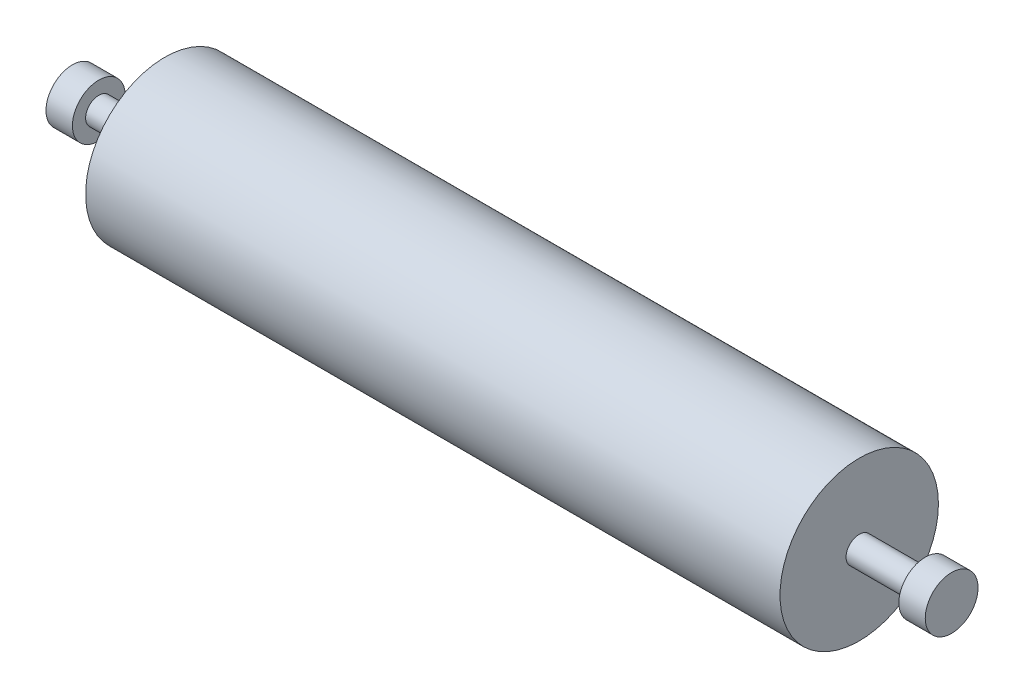
ISO-10303-21;
HEADER;
FILE_DESCRIPTION(('STEP AP214'),'2;1');
FILE_NAME('part.step','',(''),(''),'','','');
FILE_SCHEMA(('AUTOMOTIVE_DESIGN { 1 0 10303 214 1 1 1 1 }'));
ENDSEC;
DATA;
#1=APPLICATION_CONTEXT('core data for automotive mechanical design processes');
#2=APPLICATION_PROTOCOL_DEFINITION('international standard','automotive_design',2000,#1);
#3=PRODUCT_CONTEXT('',#1,'mechanical');
#4=PRODUCT('Part','Part','',(#3));
#5=PRODUCT_RELATED_PRODUCT_CATEGORY('part','',(#4));
#6=PRODUCT_DEFINITION_FORMATION('','',#4);
#7=PRODUCT_DEFINITION_CONTEXT('part definition',#1,'design');
#8=PRODUCT_DEFINITION('design','',#6,#7);
#9=PRODUCT_DEFINITION_SHAPE('','',#8);
#10=(LENGTH_UNIT() NAMED_UNIT(*) SI_UNIT(.MILLI.,.METRE.));
#11=(NAMED_UNIT(*) PLANE_ANGLE_UNIT() SI_UNIT($,.RADIAN.));
#12=(NAMED_UNIT(*) SI_UNIT($,.STERADIAN.) SOLID_ANGLE_UNIT());
#13=UNCERTAINTY_MEASURE_WITH_UNIT(LENGTH_MEASURE(1.E-05),#10,'distance_accuracy_value','');
#14=(GEOMETRIC_REPRESENTATION_CONTEXT(3) GLOBAL_UNCERTAINTY_ASSIGNED_CONTEXT((#13)) GLOBAL_UNIT_ASSIGNED_CONTEXT((#10,
#11,#12)) REPRESENTATION_CONTEXT('',''));
#15=CARTESIAN_POINT('',(0.,0.,0.));
#16=DIRECTION('',(0.,0.,1.));
#17=DIRECTION('',(1.,0.,0.));
#18=AXIS2_PLACEMENT_3D('',#15,#16,#17);
#19=CARTESIAN_POINT('',(-167.005,0.,0.));
#20=DIRECTION('',(1.,0.,0.));
#21=DIRECTION('',(0.,0.,-1.));
#22=AXIS2_PLACEMENT_3D('',#19,#20,#21);
#23=CYLINDRICAL_SURFACE('',#22,38.1);
#24=CARTESIAN_POINT('',(-167.005,0.,0.));
#25=DIRECTION('',(1.,0.,0.));
#26=DIRECTION('',(0.,0.,-1.));
#27=AXIS2_PLACEMENT_3D('',#24,#25,#26);
#28=CIRCLE('',#27,38.1);
#29=CARTESIAN_POINT('',(-167.005,0.,-38.1));
#30=VERTEX_POINT('',#29);
#31=EDGE_CURVE('E48',#30,#30,#28,.T.);
#32=ORIENTED_EDGE('',*,*,#31,.T.);
#33=EDGE_LOOP('',(#32));
#34=FACE_BOUND('',#33,.T.);
#35=CARTESIAN_POINT('',(167.005,0.,0.));
#36=DIRECTION('',(1.,0.,0.));
#37=DIRECTION('',(0.,0.,-1.));
#38=AXIS2_PLACEMENT_3D('',#35,#36,#37);
#39=CIRCLE('',#38,38.1);
#40=CARTESIAN_POINT('',(167.005,0.,-38.1));
#41=VERTEX_POINT('',#40);
#42=EDGE_CURVE('E58',#41,#41,#39,.T.);
#43=ORIENTED_EDGE('',*,*,#42,.F.);
#44=EDGE_LOOP('',(#43));
#45=FACE_BOUND('',#44,.T.);
#46=ADVANCED_FACE('F45',(#34,#45),#23,.T.);
#47=CARTESIAN_POINT('',(-167.005,0.,0.));
#48=DIRECTION('',(1.,0.,0.));
#49=DIRECTION('',(0.,0.,-1.));
#50=AXIS2_PLACEMENT_3D('',#47,#48,#49);
#51=PLANE('',#50);
#52=CARTESIAN_POINT('',(-167.005,0.,0.));
#53=DIRECTION('',(-1.,0.,0.));
#54=DIRECTION('',(0.,0.,1.));
#55=AXIS2_PLACEMENT_3D('',#52,#53,#54);
#56=CIRCLE('',#55,6.35);
#57=CARTESIAN_POINT('',(-167.005,0.,6.35));
#58=VERTEX_POINT('',#57);
#59=EDGE_CURVE('E10',#58,#58,#56,.T.);
#60=ORIENTED_EDGE('',*,*,#59,.F.);
#61=EDGE_LOOP('',(#60));
#62=FACE_BOUND('',#61,.T.);
#63=ORIENTED_EDGE('',*,*,#31,.F.);
#64=EDGE_LOOP('',(#63));
#65=FACE_BOUND('',#64,.T.);
#66=ADVANCED_FACE('F113',(#62,#65),#51,.F.);
#67=CARTESIAN_POINT('',(167.005,0.,0.));
#68=DIRECTION('',(1.,0.,0.));
#69=DIRECTION('',(0.,0.,-1.));
#70=AXIS2_PLACEMENT_3D('',#67,#68,#69);
#71=PLANE('',#70);
#72=CARTESIAN_POINT('',(167.005,0.,0.));
#73=DIRECTION('',(-1.,0.,0.));
#74=DIRECTION('',(0.,0.,1.));
#75=AXIS2_PLACEMENT_3D('',#72,#73,#74);
#76=CIRCLE('',#75,6.35);
#77=CARTESIAN_POINT('',(167.005,0.,6.35));
#78=VERTEX_POINT('',#77);
#79=EDGE_CURVE('E79',#78,#78,#76,.T.);
#80=ORIENTED_EDGE('',*,*,#79,.T.);
#81=EDGE_LOOP('',(#80));
#82=FACE_BOUND('',#81,.T.);
#83=ORIENTED_EDGE('',*,*,#42,.T.);
#84=EDGE_LOOP('',(#83));
#85=FACE_BOUND('',#84,.T.);
#86=ADVANCED_FACE('F118',(#82,#85),#71,.T.);
#87=CARTESIAN_POINT('',(-198.755,0.,0.));
#88=DIRECTION('',(1.,0.,0.));
#89=DIRECTION('',(0.,0.,-1.));
#90=AXIS2_PLACEMENT_3D('',#87,#88,#89);
#91=CYLINDRICAL_SURFACE('',#90,6.35);
#92=CARTESIAN_POINT('',(-198.755,0.,0.));
#93=DIRECTION('',(-1.,0.,0.));
#94=DIRECTION('',(0.,0.,1.));
#95=AXIS2_PLACEMENT_3D('',#92,#93,#94);
#96=CIRCLE('',#95,6.35);
#97=CARTESIAN_POINT('',(-198.755,0.,6.35));
#98=VERTEX_POINT('',#97);
#99=EDGE_CURVE('E60',#98,#98,#96,.T.);
#100=ORIENTED_EDGE('',*,*,#99,.F.);
#101=EDGE_LOOP('',(#100));
#102=FACE_BOUND('',#101,.T.);
#103=ORIENTED_EDGE('',*,*,#59,.T.);
#104=EDGE_LOOP('',(#103));
#105=FACE_BOUND('',#104,.T.);
#106=ADVANCED_FACE('F127',(#102,#105),#91,.T.);
#107=CARTESIAN_POINT('',(-211.455,0.,0.));
#108=DIRECTION('',(1.,0.,0.));
#109=DIRECTION('',(0.,0.,-1.));
#110=AXIS2_PLACEMENT_3D('',#107,#108,#109);
#111=CYLINDRICAL_SURFACE('',#110,12.7);
#112=CARTESIAN_POINT('',(-211.455,0.,0.));
#113=DIRECTION('',(-1.,0.,0.));
#114=DIRECTION('',(0.,0.,1.));
#115=AXIS2_PLACEMENT_3D('',#112,#113,#114);
#116=CIRCLE('',#115,12.7);
#117=CARTESIAN_POINT('',(-211.455,0.,12.7));
#118=VERTEX_POINT('',#117);
#119=EDGE_CURVE('E68',#118,#118,#116,.T.);
#120=ORIENTED_EDGE('',*,*,#119,.F.);
#121=EDGE_LOOP('',(#120));
#122=FACE_BOUND('',#121,.T.);
#123=CARTESIAN_POINT('',(-198.755,0.,0.));
#124=DIRECTION('',(-1.,0.,0.));
#125=DIRECTION('',(0.,0.,1.));
#126=AXIS2_PLACEMENT_3D('',#123,#124,#125);
#127=CIRCLE('',#126,12.7);
#128=CARTESIAN_POINT('',(-198.755,0.,12.7));
#129=VERTEX_POINT('',#128);
#130=EDGE_CURVE('E73',#129,#129,#127,.T.);
#131=ORIENTED_EDGE('',*,*,#130,.T.);
#132=EDGE_LOOP('',(#131));
#133=FACE_BOUND('',#132,.T.);
#134=ADVANCED_FACE('F132',(#122,#133),#111,.T.);
#135=CARTESIAN_POINT('',(-211.455,0.,0.));
#136=DIRECTION('',(-1.,0.,0.));
#137=DIRECTION('',(0.,0.,1.));
#138=AXIS2_PLACEMENT_3D('',#135,#136,#137);
#139=PLANE('',#138);
#140=ORIENTED_EDGE('',*,*,#119,.T.);
#141=EDGE_LOOP('',(#140));
#142=FACE_BOUND('',#141,.T.);
#143=ADVANCED_FACE('F136',(#142),#139,.T.);
#144=CARTESIAN_POINT('',(-198.755,0.,0.));
#145=DIRECTION('',(-1.,0.,0.));
#146=DIRECTION('',(0.,0.,1.));
#147=AXIS2_PLACEMENT_3D('',#144,#145,#146);
#148=PLANE('',#147);
#149=ORIENTED_EDGE('',*,*,#99,.T.);
#150=EDGE_LOOP('',(#149));
#151=FACE_BOUND('',#150,.T.);
#152=ORIENTED_EDGE('',*,*,#130,.F.);
#153=EDGE_LOOP('',(#152));
#154=FACE_BOUND('',#153,.T.);
#155=ADVANCED_FACE('F138',(#151,#154),#148,.F.);
#156=CARTESIAN_POINT('',(198.755,0.,0.));
#157=DIRECTION('',(-1.,0.,0.));
#158=DIRECTION('',(0.,0.,1.));
#159=AXIS2_PLACEMENT_3D('',#156,#157,#158);
#160=CYLINDRICAL_SURFACE('',#159,6.35);
#161=CARTESIAN_POINT('',(198.755,0.,0.));
#162=DIRECTION('',(-1.,0.,0.));
#163=DIRECTION('',(0.,0.,1.));
#164=AXIS2_PLACEMENT_3D('',#161,#162,#163);
#165=CIRCLE('',#164,6.35);
#166=CARTESIAN_POINT('',(198.755,0.,6.35));
#167=VERTEX_POINT('',#166);
#168=EDGE_CURVE('E84',#167,#167,#165,.T.);
#169=ORIENTED_EDGE('',*,*,#168,.T.);
#170=EDGE_LOOP('',(#169));
#171=FACE_BOUND('',#170,.T.);
#172=ORIENTED_EDGE('',*,*,#79,.F.);
#173=EDGE_LOOP('',(#172));
#174=FACE_BOUND('',#173,.T.);
#175=ADVANCED_FACE('F110',(#171,#174),#160,.T.);
#176=CARTESIAN_POINT('',(211.455,0.,0.));
#177=DIRECTION('',(-1.,0.,0.));
#178=DIRECTION('',(0.,0.,1.));
#179=AXIS2_PLACEMENT_3D('',#176,#177,#178);
#180=CYLINDRICAL_SURFACE('',#179,12.7);
#181=CARTESIAN_POINT('',(211.455,0.,0.));
#182=DIRECTION('',(-1.,0.,0.));
#183=DIRECTION('',(0.,0.,1.));
#184=AXIS2_PLACEMENT_3D('',#181,#182,#183);
#185=CIRCLE('',#184,12.7);
#186=CARTESIAN_POINT('',(211.455,0.,12.7));
#187=VERTEX_POINT('',#186);
#188=EDGE_CURVE('E88',#187,#187,#185,.T.);
#189=ORIENTED_EDGE('',*,*,#188,.T.);
#190=EDGE_LOOP('',(#189));
#191=FACE_BOUND('',#190,.T.);
#192=CARTESIAN_POINT('',(198.755,0.,0.));
#193=DIRECTION('',(-1.,0.,0.));
#194=DIRECTION('',(0.,0.,1.));
#195=AXIS2_PLACEMENT_3D('',#192,#193,#194);
#196=CIRCLE('',#195,12.7);
#197=CARTESIAN_POINT('',(198.755,0.,12.7));
#198=VERTEX_POINT('',#197);
#199=EDGE_CURVE('E89',#198,#198,#196,.T.);
#200=ORIENTED_EDGE('',*,*,#199,.F.);
#201=EDGE_LOOP('',(#200));
#202=FACE_BOUND('',#201,.T.);
#203=ADVANCED_FACE('F97',(#191,#202),#180,.T.);
#204=CARTESIAN_POINT('',(211.455,0.,0.));
#205=DIRECTION('',(1.,0.,0.));
#206=DIRECTION('',(0.,0.,1.));
#207=AXIS2_PLACEMENT_3D('',#204,#205,#206);
#208=PLANE('',#207);
#209=ORIENTED_EDGE('',*,*,#188,.F.);
#210=EDGE_LOOP('',(#209));
#211=FACE_BOUND('',#210,.T.);
#212=ADVANCED_FACE('F100',(#211),#208,.T.);
#213=CARTESIAN_POINT('',(198.755,0.,0.));
#214=DIRECTION('',(1.,0.,0.));
#215=DIRECTION('',(0.,0.,1.));
#216=AXIS2_PLACEMENT_3D('',#213,#214,#215);
#217=PLANE('',#216);
#218=ORIENTED_EDGE('',*,*,#168,.F.);
#219=EDGE_LOOP('',(#218));
#220=FACE_BOUND('',#219,.T.);
#221=ORIENTED_EDGE('',*,*,#199,.T.);
#222=EDGE_LOOP('',(#221));
#223=FACE_BOUND('',#222,.T.);
#224=ADVANCED_FACE('F102',(#220,#223),#217,.F.);
#225=CLOSED_SHELL('',(#46,#66,#86,#106,#134,#143,#155,#175,#203,#212,#224));
#226=MANIFOLD_SOLID_BREP('B2',#225);
#227=ADVANCED_BREP_SHAPE_REPRESENTATION('',(#18,#226),#14);
#228=SHAPE_DEFINITION_REPRESENTATION(#9,#227);
ENDSEC;
END-ISO-10303-21;
